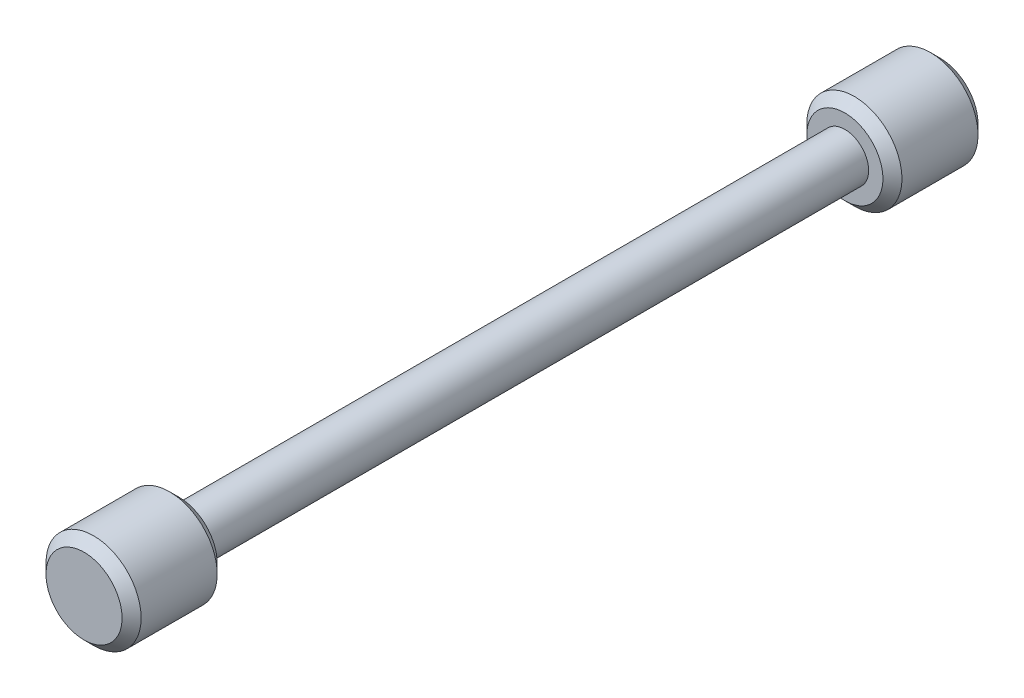
ISO-10303-21;
HEADER;
FILE_DESCRIPTION(('STEP AP214'),'2;1');
FILE_NAME('part.step','',(''),(''),'','','');
FILE_SCHEMA(('AUTOMOTIVE_DESIGN { 1 0 10303 214 1 1 1 1 }'));
ENDSEC;
DATA;
#1=APPLICATION_CONTEXT('core data for automotive mechanical design processes');
#2=APPLICATION_PROTOCOL_DEFINITION('international standard','automotive_design',2000,#1);
#3=PRODUCT_CONTEXT('',#1,'mechanical');
#4=PRODUCT('Part','Part','',(#3));
#5=PRODUCT_RELATED_PRODUCT_CATEGORY('part','',(#4));
#6=PRODUCT_DEFINITION_FORMATION('','',#4);
#7=PRODUCT_DEFINITION_CONTEXT('part definition',#1,'design');
#8=PRODUCT_DEFINITION('design','',#6,#7);
#9=PRODUCT_DEFINITION_SHAPE('','',#8);
#10=(LENGTH_UNIT() NAMED_UNIT(*) SI_UNIT(.MILLI.,.METRE.));
#11=(NAMED_UNIT(*) PLANE_ANGLE_UNIT() SI_UNIT($,.RADIAN.));
#12=(NAMED_UNIT(*) SI_UNIT($,.STERADIAN.) SOLID_ANGLE_UNIT());
#13=UNCERTAINTY_MEASURE_WITH_UNIT(LENGTH_MEASURE(1.E-05),#10,'distance_accuracy_value','');
#14=(GEOMETRIC_REPRESENTATION_CONTEXT(3) GLOBAL_UNCERTAINTY_ASSIGNED_CONTEXT((#13)) GLOBAL_UNIT_ASSIGNED_CONTEXT((#10,
#11,#12)) REPRESENTATION_CONTEXT('',''));
#15=CARTESIAN_POINT('',(0.,0.,0.));
#16=DIRECTION('',(0.,0.,1.));
#17=DIRECTION('',(1.,0.,0.));
#18=AXIS2_PLACEMENT_3D('',#15,#16,#17);
#19=CARTESIAN_POINT('',(0.,0.,-44.45));
#20=DIRECTION('',(0.,0.,1.));
#21=DIRECTION('',(0.,-1.,0.));
#22=AXIS2_PLACEMENT_3D('',#19,#20,#21);
#23=PLANE('',#22);
#24=CARTESIAN_POINT('',(0.,-3.175,-44.45));
#25=DIRECTION('',(0.,0.,1.));
#26=DIRECTION('',(0.,-1.,0.));
#27=AXIS2_PLACEMENT_3D('',#24,#25,#26);
#28=CIRCLE('',#27,5.08000000000003);
#29=CARTESIAN_POINT('',(-5.08000000000003,-3.175,-44.45));
#30=VERTEX_POINT('',#29);
#31=EDGE_CURVE('E54',#30,#30,#28,.T.);
#32=ORIENTED_EDGE('',*,*,#31,.T.);
#33=EDGE_LOOP('',(#32));
#34=FACE_BOUND('',#33,.T.);
#35=CARTESIAN_POINT('',(0.,-3.175,-44.45));
#36=DIRECTION('',(0.,0.,-1.));
#37=DIRECTION('',(0.,1.,0.));
#38=AXIS2_PLACEMENT_3D('',#35,#36,#37);
#39=CIRCLE('',#38,3.175);
#40=CARTESIAN_POINT('',(0.,0.,-44.45));
#41=VERTEX_POINT('',#40);
#42=EDGE_CURVE('E66',#41,#41,#39,.T.);
#43=ORIENTED_EDGE('',*,*,#42,.T.);
#44=EDGE_LOOP('',(#43));
#45=FACE_BOUND('',#44,.T.);
#46=ADVANCED_FACE('F31',(#34,#45),#23,.T.);
#47=CARTESIAN_POINT('',(0.,-3.175,-57.15));
#48=DIRECTION('',(0.,0.,-1.));
#49=DIRECTION('',(0.,1.,0.));
#50=AXIS2_PLACEMENT_3D('',#47,#48,#49);
#51=CYLINDRICAL_SURFACE('',#50,6.35);
#52=CARTESIAN_POINT('',(0.,-3.175,-45.72));
#53=DIRECTION('',(0.,0.,1.));
#54=DIRECTION('',(1.,0.,0.));
#55=AXIS2_PLACEMENT_3D('',#52,#53,#54);
#56=CIRCLE('',#55,6.35);
#57=CARTESIAN_POINT('',(-6.35,-3.175,-45.72));
#58=VERTEX_POINT('',#57);
#59=EDGE_CURVE('E57',#58,#58,#56,.F.);
#60=ORIENTED_EDGE('',*,*,#59,.T.);
#61=EDGE_LOOP('',(#60));
#62=FACE_BOUND('',#61,.T.);
#63=CARTESIAN_POINT('',(0.,-3.175,-55.88));
#64=DIRECTION('',(0.,0.,-1.));
#65=DIRECTION('',(-1.,0.,0.));
#66=AXIS2_PLACEMENT_3D('',#63,#64,#65);
#67=CIRCLE('',#66,6.35);
#68=CARTESIAN_POINT('',(-6.35,-3.175,-55.88));
#69=VERTEX_POINT('',#68);
#70=EDGE_CURVE('E60',#69,#69,#67,.F.);
#71=ORIENTED_EDGE('',*,*,#70,.T.);
#72=EDGE_LOOP('',(#71));
#73=FACE_BOUND('',#72,.T.);
#74=ADVANCED_FACE('F88',(#62,#73),#51,.T.);
#75=CARTESIAN_POINT('',(0.,-3.175,-57.15));
#76=DIRECTION('',(0.,0.,-1.));
#77=DIRECTION('',(0.,1.,0.));
#78=AXIS2_PLACEMENT_3D('',#75,#76,#77);
#79=PLANE('',#78);
#80=CARTESIAN_POINT('',(0.,-3.175,-57.15));
#81=DIRECTION('',(0.,0.,-1.));
#82=DIRECTION('',(0.,1.,0.));
#83=AXIS2_PLACEMENT_3D('',#80,#81,#82);
#84=CIRCLE('',#83,5.08);
#85=CARTESIAN_POINT('',(0.,1.905,-57.15));
#86=VERTEX_POINT('',#85);
#87=EDGE_CURVE('E38',#86,#86,#84,.T.);
#88=ORIENTED_EDGE('',*,*,#87,.T.);
#89=EDGE_LOOP('',(#88));
#90=FACE_BOUND('',#89,.T.);
#91=ADVANCED_FACE('F94',(#90),#79,.T.);
#92=CARTESIAN_POINT('',(0.,3.175,57.15));
#93=DIRECTION('',(0.,0.,1.));
#94=DIRECTION('',(0.,-1.,0.));
#95=AXIS2_PLACEMENT_3D('',#92,#93,#94);
#96=PLANE('',#95);
#97=CARTESIAN_POINT('',(0.,-3.17500000000002,57.15));
#98=DIRECTION('',(0.,0.,1.));
#99=DIRECTION('',(0.,-1.,0.));
#100=AXIS2_PLACEMENT_3D('',#97,#98,#99);
#101=CIRCLE('',#100,5.07999999999997);
#102=CARTESIAN_POINT('',(0.,-8.25499999999999,57.15));
#103=VERTEX_POINT('',#102);
#104=EDGE_CURVE('E10',#103,#103,#101,.T.);
#105=ORIENTED_EDGE('',*,*,#104,.T.);
#106=EDGE_LOOP('',(#105));
#107=FACE_BOUND('',#106,.T.);
#108=ADVANCED_FACE('F117',(#107),#96,.T.);
#109=CARTESIAN_POINT('',(0.,-3.175,-57.15));
#110=DIRECTION('',(0.,0.,-1.));
#111=DIRECTION('',(0.,1.,0.));
#112=AXIS2_PLACEMENT_3D('',#109,#110,#111);
#113=CYLINDRICAL_SURFACE('',#112,6.35000000000001);
#114=CARTESIAN_POINT('',(0.,-3.17500000000002,45.72));
#115=DIRECTION('',(0.,0.,-1.));
#116=DIRECTION('',(0.,1.,0.));
#117=AXIS2_PLACEMENT_3D('',#114,#115,#116);
#118=CIRCLE('',#117,6.35000000000001);
#119=CARTESIAN_POINT('',(0.,3.175,45.72));
#120=VERTEX_POINT('',#119);
#121=EDGE_CURVE('E42',#120,#120,#118,.F.);
#122=ORIENTED_EDGE('',*,*,#121,.T.);
#123=EDGE_LOOP('',(#122));
#124=FACE_BOUND('',#123,.T.);
#125=CARTESIAN_POINT('',(0.,-3.17500000000002,55.88));
#126=DIRECTION('',(0.,0.,1.));
#127=DIRECTION('',(0.,-1.,0.));
#128=AXIS2_PLACEMENT_3D('',#125,#126,#127);
#129=CIRCLE('',#128,6.35000000000001);
#130=CARTESIAN_POINT('',(0.,-9.52500000000003,55.88));
#131=VERTEX_POINT('',#130);
#132=EDGE_CURVE('E46',#131,#131,#129,.F.);
#133=ORIENTED_EDGE('',*,*,#132,.T.);
#134=EDGE_LOOP('',(#133));
#135=FACE_BOUND('',#134,.T.);
#136=ADVANCED_FACE('F84',(#124,#135),#113,.T.);
#137=CARTESIAN_POINT('',(0.,0.,44.45));
#138=DIRECTION('',(0.,0.,-1.));
#139=DIRECTION('',(0.,1.,0.));
#140=AXIS2_PLACEMENT_3D('',#137,#138,#139);
#141=PLANE('',#140);
#142=CARTESIAN_POINT('',(0.,-3.17500000000001,44.45));
#143=DIRECTION('',(0.,0.,-1.));
#144=DIRECTION('',(0.,1.,0.));
#145=AXIS2_PLACEMENT_3D('',#142,#143,#144);
#146=CIRCLE('',#145,5.08000000000003);
#147=CARTESIAN_POINT('',(0.,1.90500000000001,44.45));
#148=VERTEX_POINT('',#147);
#149=EDGE_CURVE('E51',#148,#148,#146,.T.);
#150=ORIENTED_EDGE('',*,*,#149,.T.);
#151=EDGE_LOOP('',(#150));
#152=FACE_BOUND('',#151,.T.);
#153=CARTESIAN_POINT('',(0.,-3.17500000000001,44.45));
#154=DIRECTION('',(0.,0.,-1.));
#155=DIRECTION('',(0.,1.,0.));
#156=AXIS2_PLACEMENT_3D('',#153,#154,#155);
#157=CIRCLE('',#156,3.17500000000001);
#158=CARTESIAN_POINT('',(0.,0.,44.45));
#159=VERTEX_POINT('',#158);
#160=EDGE_CURVE('E63',#159,#159,#157,.T.);
#161=ORIENTED_EDGE('',*,*,#160,.F.);
#162=EDGE_LOOP('',(#161));
#163=FACE_BOUND('',#162,.T.);
#164=ADVANCED_FACE('F74',(#152,#163),#141,.T.);
#165=CARTESIAN_POINT('',(0.,-3.175,-57.15));
#166=DIRECTION('',(0.,0.,-1.));
#167=DIRECTION('',(0.,1.,0.));
#168=AXIS2_PLACEMENT_3D('',#165,#166,#167);
#169=CYLINDRICAL_SURFACE('',#168,3.17500000000001);
#170=ORIENTED_EDGE('',*,*,#160,.T.);
#171=EDGE_LOOP('',(#170));
#172=FACE_BOUND('',#171,.T.);
#173=ORIENTED_EDGE('',*,*,#42,.F.);
#174=EDGE_LOOP('',(#173));
#175=FACE_BOUND('',#174,.T.);
#176=ADVANCED_FACE('F71',(#172,#175),#169,.T.);
#177=CARTESIAN_POINT('',(0.,-3.175,-45.72));
#178=DIRECTION('',(0.,0.,-1.));
#179=DIRECTION('',(-1.,0.,0.));
#180=AXIS2_PLACEMENT_3D('',#177,#178,#179);
#181=CONICAL_SURFACE('',#180,6.35,0.785398163397451);
#182=CARTESIAN_POINT('',(-5.08000000000003,-3.175,-44.45));
#183=CARTESIAN_POINT('',(-5.0932291666667,-3.175,-44.4632291666667));
#184=CARTESIAN_POINT('',(-5.10645833333336,-3.175,-44.4764583333333));
#185=CARTESIAN_POINT('',(-5.1329166666667,-3.175,-44.5029166666667));
#186=CARTESIAN_POINT('',(-5.14614583333336,-3.175,-44.5161458333333));
#187=CARTESIAN_POINT('',(-5.1726041666667,-3.175,-44.5426041666667));
#188=CARTESIAN_POINT('',(-5.18583333333336,-3.175,-44.5558333333333));
#189=CARTESIAN_POINT('',(-5.21229166666669,-3.175,-44.5822916666667));
#190=CARTESIAN_POINT('',(-5.22552083333336,-3.175,-44.5955208333333));
#191=CARTESIAN_POINT('',(-5.2519791666667,-3.175,-44.6219791666667));
#192=CARTESIAN_POINT('',(-5.26520833333336,-3.175,-44.6352083333333));
#193=CARTESIAN_POINT('',(-5.29166666666669,-3.175,-44.6616666666667));
#194=CARTESIAN_POINT('',(-5.30489583333336,-3.175,-44.6748958333333));
#195=CARTESIAN_POINT('',(-5.33135416666669,-3.175,-44.7013541666667));
#196=CARTESIAN_POINT('',(-5.34458333333336,-3.175,-44.7145833333333));
#197=CARTESIAN_POINT('',(-5.37104166666669,-3.175,-44.7410416666667));
#198=CARTESIAN_POINT('',(-5.38427083333336,-3.175,-44.7542708333333));
#199=CARTESIAN_POINT('',(-5.41072916666669,-3.175,-44.7807291666667));
#200=CARTESIAN_POINT('',(-5.42395833333336,-3.175,-44.7939583333333));
#201=CARTESIAN_POINT('',(-5.45041666666669,-3.175,-44.8204166666667));
#202=CARTESIAN_POINT('',(-5.46364583333336,-3.175,-44.8336458333333));
#203=CARTESIAN_POINT('',(-5.49010416666669,-3.175,-44.8601041666667));
#204=CARTESIAN_POINT('',(-5.50333333333336,-3.175,-44.8733333333333));
#205=CARTESIAN_POINT('',(-5.52979166666669,-3.175,-44.8997916666667));
#206=CARTESIAN_POINT('',(-5.54302083333335,-3.175,-44.9130208333333));
#207=CARTESIAN_POINT('',(-5.56947916666669,-3.175,-44.9394791666667));
#208=CARTESIAN_POINT('',(-5.58270833333335,-3.175,-44.9527083333333));
#209=CARTESIAN_POINT('',(-5.60916666666669,-3.175,-44.9791666666667));
#210=CARTESIAN_POINT('',(-5.62239583333335,-3.175,-44.9923958333333));
#211=CARTESIAN_POINT('',(-5.64885416666668,-3.175,-45.0188541666667));
#212=CARTESIAN_POINT('',(-5.66208333333335,-3.175,-45.0320833333333));
#213=CARTESIAN_POINT('',(-5.68854166666669,-3.175,-45.0585416666667));
#214=CARTESIAN_POINT('',(-5.70177083333335,-3.175,-45.0717708333333));
#215=CARTESIAN_POINT('',(-5.72822916666668,-3.175,-45.0982291666667));
#216=CARTESIAN_POINT('',(-5.74145833333335,-3.175,-45.1114583333333));
#217=CARTESIAN_POINT('',(-5.76791666666668,-3.175,-45.1379166666667));
#218=CARTESIAN_POINT('',(-5.78114583333335,-3.175,-45.1511458333333));
#219=CARTESIAN_POINT('',(-5.80760416666668,-3.175,-45.1776041666667));
#220=CARTESIAN_POINT('',(-5.82083333333335,-3.175,-45.1908333333333));
#221=CARTESIAN_POINT('',(-5.84729166666668,-3.175,-45.2172916666667));
#222=CARTESIAN_POINT('',(-5.86052083333335,-3.175,-45.2305208333333));
#223=CARTESIAN_POINT('',(-5.88697916666668,-3.175,-45.2569791666666));
#224=CARTESIAN_POINT('',(-5.90020833333335,-3.175,-45.2702083333333));
#225=CARTESIAN_POINT('',(-5.92666666666668,-3.175,-45.2966666666667));
#226=CARTESIAN_POINT('',(-5.93989583333334,-3.175,-45.3098958333333));
#227=CARTESIAN_POINT('',(-5.96635416666668,-3.175,-45.3363541666666));
#228=CARTESIAN_POINT('',(-5.97958333333335,-3.175,-45.3495833333333));
#229=CARTESIAN_POINT('',(-6.00604166666668,-3.175,-45.3760416666667));
#230=CARTESIAN_POINT('',(-6.01927083333334,-3.175,-45.3892708333333));
#231=CARTESIAN_POINT('',(-6.04572916666668,-3.175,-45.4157291666667));
#232=CARTESIAN_POINT('',(-6.05895833333334,-3.175,-45.4289583333333));
#233=CARTESIAN_POINT('',(-6.08541666666668,-3.175,-45.4554166666666));
#234=CARTESIAN_POINT('',(-6.09864583333334,-3.175,-45.4686458333333));
#235=CARTESIAN_POINT('',(-6.12510416666668,-3.175,-45.4951041666666));
#236=CARTESIAN_POINT('',(-6.13833333333334,-3.175,-45.5083333333333));
#237=CARTESIAN_POINT('',(-6.16479166666667,-3.175,-45.5347916666666));
#238=CARTESIAN_POINT('',(-6.17802083333334,-3.175,-45.5480208333333));
#239=CARTESIAN_POINT('',(-6.20447916666667,-3.175,-45.5744791666666));
#240=CARTESIAN_POINT('',(-6.21770833333334,-3.175,-45.5877083333333));
#241=CARTESIAN_POINT('',(-6.24416666666667,-3.175,-45.6141666666666));
#242=CARTESIAN_POINT('',(-6.25739583333334,-3.175,-45.6273958333333));
#243=CARTESIAN_POINT('',(-6.28385416666667,-3.175,-45.6538541666666));
#244=CARTESIAN_POINT('',(-6.29708333333334,-3.175,-45.6670833333333));
#245=CARTESIAN_POINT('',(-6.32354166666667,-3.175,-45.6935416666666));
#246=CARTESIAN_POINT('',(-6.33677083333334,-3.175,-45.7067708333333));
#247=CARTESIAN_POINT('',(-6.35,-3.175,-45.72));
#248=B_SPLINE_CURVE_WITH_KNOTS('',3,(#182,#183,#184,#185,#186,#187,#188,#189,#190,#191,#192,
#193,#194,#195,#196,#197,#198,#199,#200,#201,#202,#203,#204,#205,#206,#207,#208,#209,#210,#211,
#212,#213,#214,#215,#216,#217,#218,#219,#220,#221,#222,#223,#224,#225,#226,#227,#228,#229,#230,
#231,#232,#233,#234,#235,#236,#237,#238,#239,#240,#241,#242,#243,#244,#245,#246,#247),
.UNSPECIFIED.,.F.,.F.,(4,2,2,2,2,2,2,2,2,2,2,2,2,2,2,2,2,2,2,2,2,2,2,2,2,2,2,2,2,2,2,2,4),(0.,
0.0561266007566788,0.112253201513358,0.168379802270042,0.224506403026721,0.2806330037834,
0.336759604540084,0.392886205296763,0.449012806053447,0.505139406810126,0.561266007566804,
0.617392608323489,0.673519209080168,0.729645809836847,0.78577241059353,0.84189901135021,
0.898025612106893,0.954152212863572,1.01027881362025,1.06640541437694,1.12253201513361,
1.17865861589029,1.23478521664698,1.29091181740366,1.34703841816034,1.40316501891702,
1.4592916196737,1.51541822043038,1.57154482118706,1.62767142194374,1.68379802270042,
1.7399246234571,1.79605122421378),.UNSPECIFIED.);
#249=EDGE_CURVE('BSEAM73',#30,#58,#248,.T.);
#250=ORIENTED_EDGE('',*,*,#31,.F.);
#251=ORIENTED_EDGE('',*,*,#59,.F.);
#252=ORIENTED_EDGE('',*,*,#249,.T.);
#253=ORIENTED_EDGE('',*,*,#249,.F.);
#254=EDGE_LOOP('',(#250,#252,#251,#253));
#255=FACE_BOUND('',#254,.T.);
#256=ADVANCED_FACE('F73',(#255),#181,.T.);
#257=CARTESIAN_POINT('',(0.,-3.17500000000001,44.45));
#258=DIRECTION('',(0.,0.,1.));
#259=DIRECTION('',(0.,-1.,0.));
#260=AXIS2_PLACEMENT_3D('',#257,#258,#259);
#261=CONICAL_SURFACE('',#260,5.08000000000003,0.785398163397445);
#262=ORIENTED_EDGE('',*,*,#121,.F.);
#263=EDGE_LOOP('',(#262));
#264=FACE_BOUND('',#263,.T.);
#265=ORIENTED_EDGE('',*,*,#149,.F.);
#266=EDGE_LOOP('',(#265));
#267=FACE_BOUND('',#266,.T.);
#268=ADVANCED_FACE('F81',(#264,#267),#261,.T.);
#269=CARTESIAN_POINT('',(0.,-3.175,-57.15));
#270=DIRECTION('',(0.,0.,1.));
#271=DIRECTION('',(1.,0.,0.));
#272=AXIS2_PLACEMENT_3D('',#269,#270,#271);
#273=CONICAL_SURFACE('',#272,5.08,0.785398163397448);
#274=ORIENTED_EDGE('',*,*,#70,.F.);
#275=EDGE_LOOP('',(#274));
#276=FACE_BOUND('',#275,.T.);
#277=ORIENTED_EDGE('',*,*,#87,.F.);
#278=EDGE_LOOP('',(#277));
#279=FACE_BOUND('',#278,.T.);
#280=ADVANCED_FACE('F100',(#276,#279),#273,.T.);
#281=CARTESIAN_POINT('',(0.,-3.17500000000002,55.88));
#282=DIRECTION('',(0.,0.,-1.));
#283=DIRECTION('',(0.,1.,0.));
#284=AXIS2_PLACEMENT_3D('',#281,#282,#283);
#285=CONICAL_SURFACE('',#284,6.35000000000001,0.785398163397456);
#286=ORIENTED_EDGE('',*,*,#104,.F.);
#287=EDGE_LOOP('',(#286));
#288=FACE_BOUND('',#287,.T.);
#289=ORIENTED_EDGE('',*,*,#132,.F.);
#290=EDGE_LOOP('',(#289));
#291=FACE_BOUND('',#290,.T.);
#292=ADVANCED_FACE('F33',(#288,#291),#285,.T.);
#293=CLOSED_SHELL('',(#46,#74,#91,#108,#136,#164,#176,#256,#268,#280,#292));
#294=MANIFOLD_SOLID_BREP('B2',#293);
#295=ADVANCED_BREP_SHAPE_REPRESENTATION('',(#18,#294),#14);
#296=SHAPE_DEFINITION_REPRESENTATION(#9,#295);
ENDSEC;
END-ISO-10303-21;
